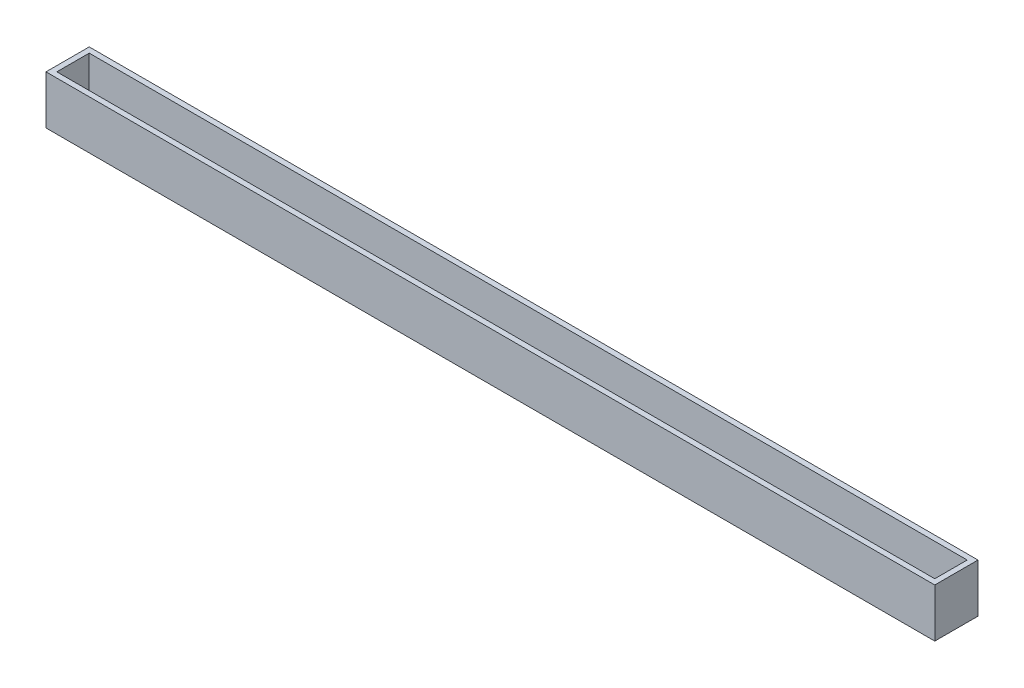
ISO-10303-21;
HEADER;
FILE_DESCRIPTION(('STEP AP214'),'2;1');
FILE_NAME('part.step','',(''),(''),'','','');
FILE_SCHEMA(('AUTOMOTIVE_DESIGN { 1 0 10303 214 1 1 1 1 }'));
ENDSEC;
DATA;
#1=APPLICATION_CONTEXT('core data for automotive mechanical design processes');
#2=APPLICATION_PROTOCOL_DEFINITION('international standard','automotive_design',2000,#1);
#3=PRODUCT_CONTEXT('',#1,'mechanical');
#4=PRODUCT('Part','Part','',(#3));
#5=PRODUCT_RELATED_PRODUCT_CATEGORY('part','',(#4));
#6=PRODUCT_DEFINITION_FORMATION('','',#4);
#7=PRODUCT_DEFINITION_CONTEXT('part definition',#1,'design');
#8=PRODUCT_DEFINITION('design','',#6,#7);
#9=PRODUCT_DEFINITION_SHAPE('','',#8);
#10=(LENGTH_UNIT() NAMED_UNIT(*) SI_UNIT(.MILLI.,.METRE.));
#11=(NAMED_UNIT(*) PLANE_ANGLE_UNIT() SI_UNIT($,.RADIAN.));
#12=(NAMED_UNIT(*) SI_UNIT($,.STERADIAN.) SOLID_ANGLE_UNIT());
#13=UNCERTAINTY_MEASURE_WITH_UNIT(LENGTH_MEASURE(1.E-05),#10,'distance_accuracy_value','');
#14=(GEOMETRIC_REPRESENTATION_CONTEXT(3) GLOBAL_UNCERTAINTY_ASSIGNED_CONTEXT((#13)) GLOBAL_UNIT_ASSIGNED_CONTEXT((#10,
#11,#12)) REPRESENTATION_CONTEXT('',''));
#15=CARTESIAN_POINT('',(0.,0.,0.));
#16=DIRECTION('',(0.,0.,1.));
#17=DIRECTION('',(1.,0.,0.));
#18=AXIS2_PLACEMENT_3D('',#15,#16,#17);
#19=CARTESIAN_POINT('',(0.,180.,0.));
#20=DIRECTION('',(0.,-1.,0.));
#21=DIRECTION('',(0.,0.,-1.));
#22=AXIS2_PLACEMENT_3D('',#19,#20,#21);
#23=PLANE('',#22);
#24=DIRECTION('',(0.,0.,-1.));
#25=VECTOR('',#24,1.);
#26=CARTESIAN_POINT('',(1644.99999999999,180.,79.9999999999994));
#27=LINE('',#26,#25);
#28=CARTESIAN_POINT('',(1644.99999999999,180.,79.9999999999994));
#29=VERTEX_POINT('',#28);
#30=CARTESIAN_POINT('',(1644.99999999999,180.,-79.9999999999994));
#31=VERTEX_POINT('',#30);
#32=EDGE_CURVE('E157',#29,#31,#27,.T.);
#33=ORIENTED_EDGE('',*,*,#32,.T.);
#34=DIRECTION('',(-1.,0.,0.));
#35=VECTOR('',#34,1.);
#36=CARTESIAN_POINT('',(-1645.00000000001,180.,-79.9999999999994));
#37=LINE('',#36,#35);
#38=CARTESIAN_POINT('',(-1645.00000000001,180.,-79.9999999999994));
#39=VERTEX_POINT('',#38);
#40=EDGE_CURVE('E92',#31,#39,#37,.T.);
#41=ORIENTED_EDGE('',*,*,#40,.T.);
#42=DIRECTION('',(0.,0.,1.));
#43=VECTOR('',#42,1.);
#44=CARTESIAN_POINT('',(-1645.00000000001,180.,80.0000000000006));
#45=LINE('',#44,#43);
#46=CARTESIAN_POINT('',(-1645.00000000001,180.,80.0000000000006));
#47=VERTEX_POINT('',#46);
#48=EDGE_CURVE('E162',#39,#47,#45,.T.);
#49=ORIENTED_EDGE('',*,*,#48,.T.);
#50=DIRECTION('',(1.,0.,0.));
#51=VECTOR('',#50,1.);
#52=CARTESIAN_POINT('',(-1645.00000000001,180.,80.0000000000006));
#53=LINE('',#52,#51);
#54=EDGE_CURVE('E64',#47,#29,#53,.T.);
#55=ORIENTED_EDGE('',*,*,#54,.T.);
#56=EDGE_LOOP('',(#33,#41,#49,#55));
#57=FACE_BOUND('',#56,.T.);
#58=DIRECTION('',(0.,0.,-1.));
#59=VECTOR('',#58,1.);
#60=CARTESIAN_POINT('',(1624.99999999999,180.,0.));
#61=LINE('',#60,#59);
#62=CARTESIAN_POINT('',(1624.99999999999,180.,59.9999999999994));
#63=VERTEX_POINT('',#62);
#64=CARTESIAN_POINT('',(1624.99999999999,180.,-59.9999999999994));
#65=VERTEX_POINT('',#64);
#66=EDGE_CURVE('E141',#63,#65,#61,.T.);
#67=ORIENTED_EDGE('',*,*,#66,.F.);
#68=DIRECTION('',(1.,0.,0.));
#69=VECTOR('',#68,1.);
#70=CARTESIAN_POINT('',(0.,180.,60.));
#71=LINE('',#70,#69);
#72=CARTESIAN_POINT('',(-1625.00000000001,180.,60.0000000000006));
#73=VERTEX_POINT('',#72);
#74=EDGE_CURVE('E154',#73,#63,#71,.T.);
#75=ORIENTED_EDGE('',*,*,#74,.F.);
#76=DIRECTION('',(0.,0.,1.));
#77=VECTOR('',#76,1.);
#78=CARTESIAN_POINT('',(-1625.00000000001,180.,0.));
#79=LINE('',#78,#77);
#80=CARTESIAN_POINT('',(-1625.00000000001,180.,-59.9999999999994));
#81=VERTEX_POINT('',#80);
#82=EDGE_CURVE('E151',#81,#73,#79,.T.);
#83=ORIENTED_EDGE('',*,*,#82,.F.);
#84=DIRECTION('',(-1.,0.,0.));
#85=VECTOR('',#84,1.);
#86=CARTESIAN_POINT('',(0.,180.,-59.9999999999994));
#87=LINE('',#86,#85);
#88=EDGE_CURVE('E130',#65,#81,#87,.T.);
#89=ORIENTED_EDGE('',*,*,#88,.F.);
#90=EDGE_LOOP('',(#67,#75,#83,#89));
#91=FACE_BOUND('',#90,.T.);
#92=ADVANCED_FACE('F39',(#57,#91),#23,.F.);
#93=CARTESIAN_POINT('',(1644.99999999999,180.,79.9999999999994));
#94=DIRECTION('',(-1.,0.,0.));
#95=DIRECTION('',(0.,0.,1.));
#96=AXIS2_PLACEMENT_3D('',#93,#94,#95);
#97=PLANE('',#96);
#98=DIRECTION('',(0.,0.,-1.));
#99=VECTOR('',#98,1.);
#100=CARTESIAN_POINT('',(1644.99999999999,0.,79.9999999999994));
#101=LINE('',#100,#99);
#102=CARTESIAN_POINT('',(1644.99999999999,0.,79.9999999999994));
#103=VERTEX_POINT('',#102);
#104=CARTESIAN_POINT('',(1644.99999999999,0.,-79.9999999999994));
#105=VERTEX_POINT('',#104);
#106=EDGE_CURVE('E168',#103,#105,#101,.T.);
#107=ORIENTED_EDGE('',*,*,#106,.T.);
#108=DIRECTION('',(0.,-1.,0.));
#109=VECTOR('',#108,1.);
#110=CARTESIAN_POINT('',(1644.99999999999,180.,-79.9999999999994));
#111=LINE('',#110,#109);
#112=EDGE_CURVE('E11',#31,#105,#111,.T.);
#113=ORIENTED_EDGE('',*,*,#112,.F.);
#114=ORIENTED_EDGE('',*,*,#32,.F.);
#115=DIRECTION('',(0.,-1.,0.));
#116=VECTOR('',#115,1.);
#117=CARTESIAN_POINT('',(1644.99999999999,180.,79.9999999999994));
#118=LINE('',#117,#116);
#119=EDGE_CURVE('E167',#29,#103,#118,.T.);
#120=ORIENTED_EDGE('',*,*,#119,.T.);
#121=EDGE_LOOP('',(#107,#113,#114,#120));
#122=FACE_BOUND('',#121,.T.);
#123=ADVANCED_FACE('F41',(#122),#97,.F.);
#124=CARTESIAN_POINT('',(-1645.00000000001,180.,-79.9999999999994));
#125=DIRECTION('',(0.,0.,1.));
#126=DIRECTION('',(1.,0.,0.));
#127=AXIS2_PLACEMENT_3D('',#124,#125,#126);
#128=PLANE('',#127);
#129=DIRECTION('',(-1.,0.,0.));
#130=VECTOR('',#129,1.);
#131=CARTESIAN_POINT('',(-1645.00000000001,0.,-79.9999999999994));
#132=LINE('',#131,#130);
#133=CARTESIAN_POINT('',(-1645.00000000001,0.,-79.9999999999994));
#134=VERTEX_POINT('',#133);
#135=EDGE_CURVE('E172',#105,#134,#132,.T.);
#136=ORIENTED_EDGE('',*,*,#135,.T.);
#137=DIRECTION('',(0.,-1.,0.));
#138=VECTOR('',#137,1.);
#139=CARTESIAN_POINT('',(-1645.00000000001,180.,-79.9999999999994));
#140=LINE('',#139,#138);
#141=EDGE_CURVE('E48',#39,#134,#140,.T.);
#142=ORIENTED_EDGE('',*,*,#141,.F.);
#143=ORIENTED_EDGE('',*,*,#40,.F.);
#144=ORIENTED_EDGE('',*,*,#112,.T.);
#145=EDGE_LOOP('',(#136,#142,#143,#144));
#146=FACE_BOUND('',#145,.T.);
#147=ADVANCED_FACE('F206',(#146),#128,.F.);
#148=CARTESIAN_POINT('',(-1645.00000000001,180.,80.0000000000006));
#149=DIRECTION('',(1.,0.,0.));
#150=DIRECTION('',(0.,0.,-1.));
#151=AXIS2_PLACEMENT_3D('',#148,#149,#150);
#152=PLANE('',#151);
#153=DIRECTION('',(0.,0.,1.));
#154=VECTOR('',#153,1.);
#155=CARTESIAN_POINT('',(-1645.00000000001,0.,80.0000000000006));
#156=LINE('',#155,#154);
#157=CARTESIAN_POINT('',(-1645.00000000001,0.,80.0000000000006));
#158=VERTEX_POINT('',#157);
#159=EDGE_CURVE('E175',#134,#158,#156,.T.);
#160=ORIENTED_EDGE('',*,*,#159,.T.);
#161=DIRECTION('',(0.,-1.,0.));
#162=VECTOR('',#161,1.);
#163=CARTESIAN_POINT('',(-1645.00000000001,180.,80.0000000000006));
#164=LINE('',#163,#162);
#165=EDGE_CURVE('E182',#47,#158,#164,.T.);
#166=ORIENTED_EDGE('',*,*,#165,.F.);
#167=ORIENTED_EDGE('',*,*,#48,.F.);
#168=ORIENTED_EDGE('',*,*,#141,.T.);
#169=EDGE_LOOP('',(#160,#166,#167,#168));
#170=FACE_BOUND('',#169,.T.);
#171=ADVANCED_FACE('F189',(#170),#152,.F.);
#172=CARTESIAN_POINT('',(-1645.00000000001,180.,80.0000000000006));
#173=DIRECTION('',(0.,0.,-1.));
#174=DIRECTION('',(-1.,0.,0.));
#175=AXIS2_PLACEMENT_3D('',#172,#173,#174);
#176=PLANE('',#175);
#177=DIRECTION('',(1.,0.,0.));
#178=VECTOR('',#177,1.);
#179=CARTESIAN_POINT('',(-1645.00000000001,0.,80.0000000000006));
#180=LINE('',#179,#178);
#181=EDGE_CURVE('E85',#158,#103,#180,.T.);
#182=ORIENTED_EDGE('',*,*,#181,.T.);
#183=ORIENTED_EDGE('',*,*,#119,.F.);
#184=ORIENTED_EDGE('',*,*,#54,.F.);
#185=ORIENTED_EDGE('',*,*,#165,.T.);
#186=EDGE_LOOP('',(#182,#183,#184,#185));
#187=FACE_BOUND('',#186,.T.);
#188=ADVANCED_FACE('F197',(#187),#176,.F.);
#189=CARTESIAN_POINT('',(0.,0.,0.));
#190=DIRECTION('',(0.,-1.,0.));
#191=DIRECTION('',(0.,0.,-1.));
#192=AXIS2_PLACEMENT_3D('',#189,#190,#191);
#193=PLANE('',#192);
#194=ORIENTED_EDGE('',*,*,#106,.F.);
#195=ORIENTED_EDGE('',*,*,#181,.F.);
#196=ORIENTED_EDGE('',*,*,#159,.F.);
#197=ORIENTED_EDGE('',*,*,#135,.F.);
#198=EDGE_LOOP('',(#194,#195,#196,#197));
#199=FACE_BOUND('',#198,.T.);
#200=ADVANCED_FACE('F193',(#199),#193,.T.);
#201=CARTESIAN_POINT('',(1624.99999999999,180.,79.9999999999994));
#202=DIRECTION('',(-1.,0.,0.));
#203=DIRECTION('',(0.,0.,1.));
#204=AXIS2_PLACEMENT_3D('',#201,#202,#203);
#205=PLANE('',#204);
#206=DIRECTION('',(0.,0.,-1.));
#207=VECTOR('',#206,1.);
#208=CARTESIAN_POINT('',(1624.99999999999,20.,0.));
#209=LINE('',#208,#207);
#210=CARTESIAN_POINT('',(1624.99999999999,20.,59.9999999999994));
#211=VERTEX_POINT('',#210);
#212=CARTESIAN_POINT('',(1624.99999999999,20.,-59.9999999999994));
#213=VERTEX_POINT('',#212);
#214=EDGE_CURVE('E120',#211,#213,#209,.T.);
#215=ORIENTED_EDGE('',*,*,#214,.F.);
#216=DIRECTION('',(0.,-1.,0.));
#217=VECTOR('',#216,1.);
#218=CARTESIAN_POINT('',(1624.99999999999,180.,59.9999999999994));
#219=LINE('',#218,#217);
#220=EDGE_CURVE('E145',#63,#211,#219,.T.);
#221=ORIENTED_EDGE('',*,*,#220,.F.);
#222=ORIENTED_EDGE('',*,*,#66,.T.);
#223=DIRECTION('',(0.,-1.,0.));
#224=VECTOR('',#223,1.);
#225=CARTESIAN_POINT('',(1624.99999999999,180.,-59.9999999999994));
#226=LINE('',#225,#224);
#227=EDGE_CURVE('E134',#65,#213,#226,.T.);
#228=ORIENTED_EDGE('',*,*,#227,.T.);
#229=EDGE_LOOP('',(#215,#221,#222,#228));
#230=FACE_BOUND('',#229,.T.);
#231=ADVANCED_FACE('F204',(#230),#205,.T.);
#232=CARTESIAN_POINT('',(-1645.00000000001,180.,-59.9999999999994));
#233=DIRECTION('',(0.,0.,1.));
#234=DIRECTION('',(1.,0.,0.));
#235=AXIS2_PLACEMENT_3D('',#232,#233,#234);
#236=PLANE('',#235);
#237=DIRECTION('',(-1.,0.,0.));
#238=VECTOR('',#237,1.);
#239=CARTESIAN_POINT('',(0.,20.,-59.9999999999994));
#240=LINE('',#239,#238);
#241=CARTESIAN_POINT('',(-1625.00000000001,20.,-59.9999999999994));
#242=VERTEX_POINT('',#241);
#243=EDGE_CURVE('E114',#213,#242,#240,.T.);
#244=ORIENTED_EDGE('',*,*,#243,.F.);
#245=ORIENTED_EDGE('',*,*,#227,.F.);
#246=ORIENTED_EDGE('',*,*,#88,.T.);
#247=DIRECTION('',(0.,-1.,0.));
#248=VECTOR('',#247,1.);
#249=CARTESIAN_POINT('',(-1625.00000000001,180.,-59.9999999999994));
#250=LINE('',#249,#248);
#251=EDGE_CURVE('E127',#81,#242,#250,.T.);
#252=ORIENTED_EDGE('',*,*,#251,.T.);
#253=EDGE_LOOP('',(#244,#245,#246,#252));
#254=FACE_BOUND('',#253,.T.);
#255=ADVANCED_FACE('F128',(#254),#236,.T.);
#256=CARTESIAN_POINT('',(-1625.00000000001,180.,80.0000000000006));
#257=DIRECTION('',(1.,0.,0.));
#258=DIRECTION('',(0.,0.,-1.));
#259=AXIS2_PLACEMENT_3D('',#256,#257,#258);
#260=PLANE('',#259);
#261=DIRECTION('',(0.,0.,1.));
#262=VECTOR('',#261,1.);
#263=CARTESIAN_POINT('',(-1625.00000000001,20.,0.));
#264=LINE('',#263,#262);
#265=CARTESIAN_POINT('',(-1625.00000000001,20.,60.0000000000006));
#266=VERTEX_POINT('',#265);
#267=EDGE_CURVE('E118',#242,#266,#264,.T.);
#268=ORIENTED_EDGE('',*,*,#267,.F.);
#269=ORIENTED_EDGE('',*,*,#251,.F.);
#270=ORIENTED_EDGE('',*,*,#82,.T.);
#271=DIRECTION('',(0.,-1.,0.));
#272=VECTOR('',#271,1.);
#273=CARTESIAN_POINT('',(-1625.00000000001,180.,60.0000000000006));
#274=LINE('',#273,#272);
#275=EDGE_CURVE('E55',#73,#266,#274,.T.);
#276=ORIENTED_EDGE('',*,*,#275,.T.);
#277=EDGE_LOOP('',(#268,#269,#270,#276));
#278=FACE_BOUND('',#277,.T.);
#279=ADVANCED_FACE('F136',(#278),#260,.T.);
#280=CARTESIAN_POINT('',(-1645.00000000001,180.,60.0000000000006));
#281=DIRECTION('',(0.,0.,-1.));
#282=DIRECTION('',(-1.,0.,0.));
#283=AXIS2_PLACEMENT_3D('',#280,#281,#282);
#284=PLANE('',#283);
#285=DIRECTION('',(1.,0.,0.));
#286=VECTOR('',#285,1.);
#287=CARTESIAN_POINT('',(0.,20.,60.));
#288=LINE('',#287,#286);
#289=EDGE_CURVE('E138',#266,#211,#288,.T.);
#290=ORIENTED_EDGE('',*,*,#289,.F.);
#291=ORIENTED_EDGE('',*,*,#275,.F.);
#292=ORIENTED_EDGE('',*,*,#74,.T.);
#293=ORIENTED_EDGE('',*,*,#220,.T.);
#294=EDGE_LOOP('',(#290,#291,#292,#293));
#295=FACE_BOUND('',#294,.T.);
#296=ADVANCED_FACE('F217',(#295),#284,.T.);
#297=CARTESIAN_POINT('',(0.,20.,0.));
#298=DIRECTION('',(0.,-1.,0.));
#299=DIRECTION('',(0.,0.,-1.));
#300=AXIS2_PLACEMENT_3D('',#297,#298,#299);
#301=PLANE('',#300);
#302=ORIENTED_EDGE('',*,*,#214,.T.);
#303=ORIENTED_EDGE('',*,*,#243,.T.);
#304=ORIENTED_EDGE('',*,*,#267,.T.);
#305=ORIENTED_EDGE('',*,*,#289,.T.);
#306=EDGE_LOOP('',(#302,#303,#304,#305));
#307=FACE_BOUND('',#306,.T.);
#308=ADVANCED_FACE('F116',(#307),#301,.F.);
#309=CLOSED_SHELL('',(#92,#123,#147,#171,#188,#200,#231,#255,#279,#296,#308));
#310=MANIFOLD_SOLID_BREP('B2',#309);
#311=ADVANCED_BREP_SHAPE_REPRESENTATION('',(#18,#310),#14);
#312=SHAPE_DEFINITION_REPRESENTATION(#9,#311);
ENDSEC;
END-ISO-10303-21;
